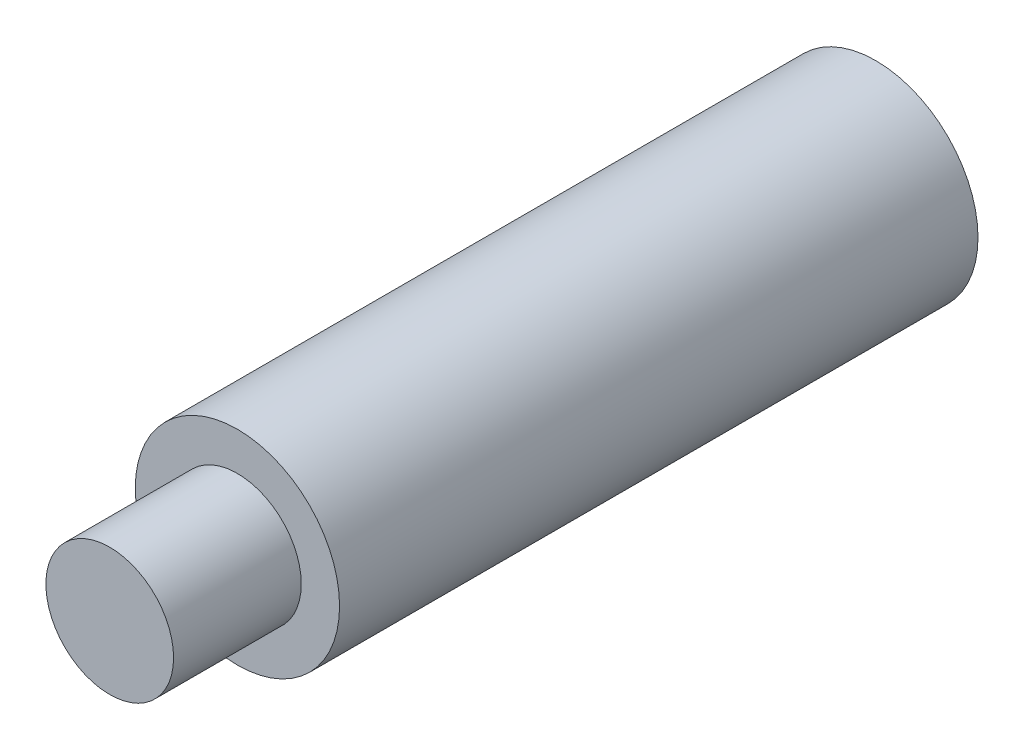
ISO-10303-21;
HEADER;
FILE_DESCRIPTION(('STEP AP214'),'2;1');
FILE_NAME('part.step','',(''),(''),'','','');
FILE_SCHEMA(('AUTOMOTIVE_DESIGN { 1 0 10303 214 1 1 1 1 }'));
ENDSEC;
DATA;
#1=APPLICATION_CONTEXT('core data for automotive mechanical design processes');
#2=APPLICATION_PROTOCOL_DEFINITION('international standard','automotive_design',2000,#1);
#3=PRODUCT_CONTEXT('',#1,'mechanical');
#4=PRODUCT('Part','Part','',(#3));
#5=PRODUCT_RELATED_PRODUCT_CATEGORY('part','',(#4));
#6=PRODUCT_DEFINITION_FORMATION('','',#4);
#7=PRODUCT_DEFINITION_CONTEXT('part definition',#1,'design');
#8=PRODUCT_DEFINITION('design','',#6,#7);
#9=PRODUCT_DEFINITION_SHAPE('','',#8);
#10=(LENGTH_UNIT() NAMED_UNIT(*) SI_UNIT(.MILLI.,.METRE.));
#11=(NAMED_UNIT(*) PLANE_ANGLE_UNIT() SI_UNIT($,.RADIAN.));
#12=(NAMED_UNIT(*) SI_UNIT($,.STERADIAN.) SOLID_ANGLE_UNIT());
#13=UNCERTAINTY_MEASURE_WITH_UNIT(LENGTH_MEASURE(1.E-05),#10,'distance_accuracy_value','');
#14=(GEOMETRIC_REPRESENTATION_CONTEXT(3) GLOBAL_UNCERTAINTY_ASSIGNED_CONTEXT((#13)) GLOBAL_UNIT_ASSIGNED_CONTEXT((#10,
#11,#12)) REPRESENTATION_CONTEXT('',''));
#15=CARTESIAN_POINT('',(0.,0.,0.));
#16=DIRECTION('',(0.,0.,1.));
#17=DIRECTION('',(1.,0.,0.));
#18=AXIS2_PLACEMENT_3D('',#15,#16,#17);
#19=CARTESIAN_POINT('',(0.,0.,25.));
#20=DIRECTION('',(0.,0.,-1.));
#21=DIRECTION('',(-1.,0.,0.));
#22=AXIS2_PLACEMENT_3D('',#19,#20,#21);
#23=CYLINDRICAL_SURFACE('',#22,4.);
#24=CARTESIAN_POINT('',(0.,0.,25.));
#25=DIRECTION('',(0.,0.,1.));
#26=DIRECTION('',(1.,0.,0.));
#27=AXIS2_PLACEMENT_3D('',#24,#25,#26);
#28=CIRCLE('',#27,4.);
#29=CARTESIAN_POINT('',(4.,0.,25.));
#30=VERTEX_POINT('',#29);
#31=EDGE_CURVE('E39',#30,#30,#28,.T.);
#32=ORIENTED_EDGE('',*,*,#31,.F.);
#33=EDGE_LOOP('',(#32));
#34=FACE_BOUND('',#33,.T.);
#35=CARTESIAN_POINT('',(0.,0.,0.));
#36=DIRECTION('',(0.,0.,1.));
#37=DIRECTION('',(1.,0.,0.));
#38=AXIS2_PLACEMENT_3D('',#35,#36,#37);
#39=CIRCLE('',#38,4.);
#40=CARTESIAN_POINT('',(4.,0.,0.));
#41=VERTEX_POINT('',#40);
#42=EDGE_CURVE('E35',#41,#41,#39,.T.);
#43=ORIENTED_EDGE('',*,*,#42,.T.);
#44=EDGE_LOOP('',(#43));
#45=FACE_BOUND('',#44,.T.);
#46=ADVANCED_FACE('F32',(#34,#45),#23,.T.);
#47=CARTESIAN_POINT('',(0.,0.,25.));
#48=DIRECTION('',(0.,0.,1.));
#49=DIRECTION('',(1.,0.,0.));
#50=AXIS2_PLACEMENT_3D('',#47,#48,#49);
#51=PLANE('',#50);
#52=CARTESIAN_POINT('',(0.,0.,25.));
#53=DIRECTION('',(0.,0.,1.));
#54=DIRECTION('',(1.,0.,0.));
#55=AXIS2_PLACEMENT_3D('',#52,#53,#54);
#56=CIRCLE('',#55,2.5);
#57=CARTESIAN_POINT('',(2.5,0.,25.));
#58=VERTEX_POINT('',#57);
#59=EDGE_CURVE('E10',#58,#58,#56,.T.);
#60=ORIENTED_EDGE('',*,*,#59,.F.);
#61=EDGE_LOOP('',(#60));
#62=FACE_BOUND('',#61,.T.);
#63=ORIENTED_EDGE('',*,*,#31,.T.);
#64=EDGE_LOOP('',(#63));
#65=FACE_BOUND('',#64,.T.);
#66=ADVANCED_FACE('F56',(#62,#65),#51,.T.);
#67=CARTESIAN_POINT('',(0.,0.,0.));
#68=DIRECTION('',(0.,0.,1.));
#69=DIRECTION('',(1.,0.,0.));
#70=AXIS2_PLACEMENT_3D('',#67,#68,#69);
#71=PLANE('',#70);
#72=ORIENTED_EDGE('',*,*,#42,.F.);
#73=EDGE_LOOP('',(#72));
#74=FACE_BOUND('',#73,.T.);
#75=ADVANCED_FACE('F53',(#74),#71,.F.);
#76=CARTESIAN_POINT('',(0.,0.,30.));
#77=DIRECTION('',(0.,0.,-1.));
#78=DIRECTION('',(-1.,0.,0.));
#79=AXIS2_PLACEMENT_3D('',#76,#77,#78);
#80=CYLINDRICAL_SURFACE('',#79,2.5);
#81=CARTESIAN_POINT('',(0.,0.,30.));
#82=DIRECTION('',(0.,0.,1.));
#83=DIRECTION('',(1.,0.,0.));
#84=AXIS2_PLACEMENT_3D('',#81,#82,#83);
#85=CIRCLE('',#84,2.5);
#86=CARTESIAN_POINT('',(2.5,0.,30.));
#87=VERTEX_POINT('',#86);
#88=EDGE_CURVE('E45',#87,#87,#85,.T.);
#89=ORIENTED_EDGE('',*,*,#88,.F.);
#90=EDGE_LOOP('',(#89));
#91=FACE_BOUND('',#90,.T.);
#92=ORIENTED_EDGE('',*,*,#59,.T.);
#93=EDGE_LOOP('',(#92));
#94=FACE_BOUND('',#93,.T.);
#95=ADVANCED_FACE('F55',(#91,#94),#80,.T.);
#96=CARTESIAN_POINT('',(0.,0.,30.));
#97=DIRECTION('',(0.,0.,1.));
#98=DIRECTION('',(1.,0.,0.));
#99=AXIS2_PLACEMENT_3D('',#96,#97,#98);
#100=PLANE('',#99);
#101=ORIENTED_EDGE('',*,*,#88,.T.);
#102=EDGE_LOOP('',(#101));
#103=FACE_BOUND('',#102,.T.);
#104=ADVANCED_FACE('F61',(#103),#100,.T.);
#105=CLOSED_SHELL('',(#46,#66,#75,#95,#104));
#106=MANIFOLD_SOLID_BREP('B2',#105);
#107=ADVANCED_BREP_SHAPE_REPRESENTATION('',(#18,#106),#14);
#108=SHAPE_DEFINITION_REPRESENTATION(#9,#107);
ENDSEC;
END-ISO-10303-21;
